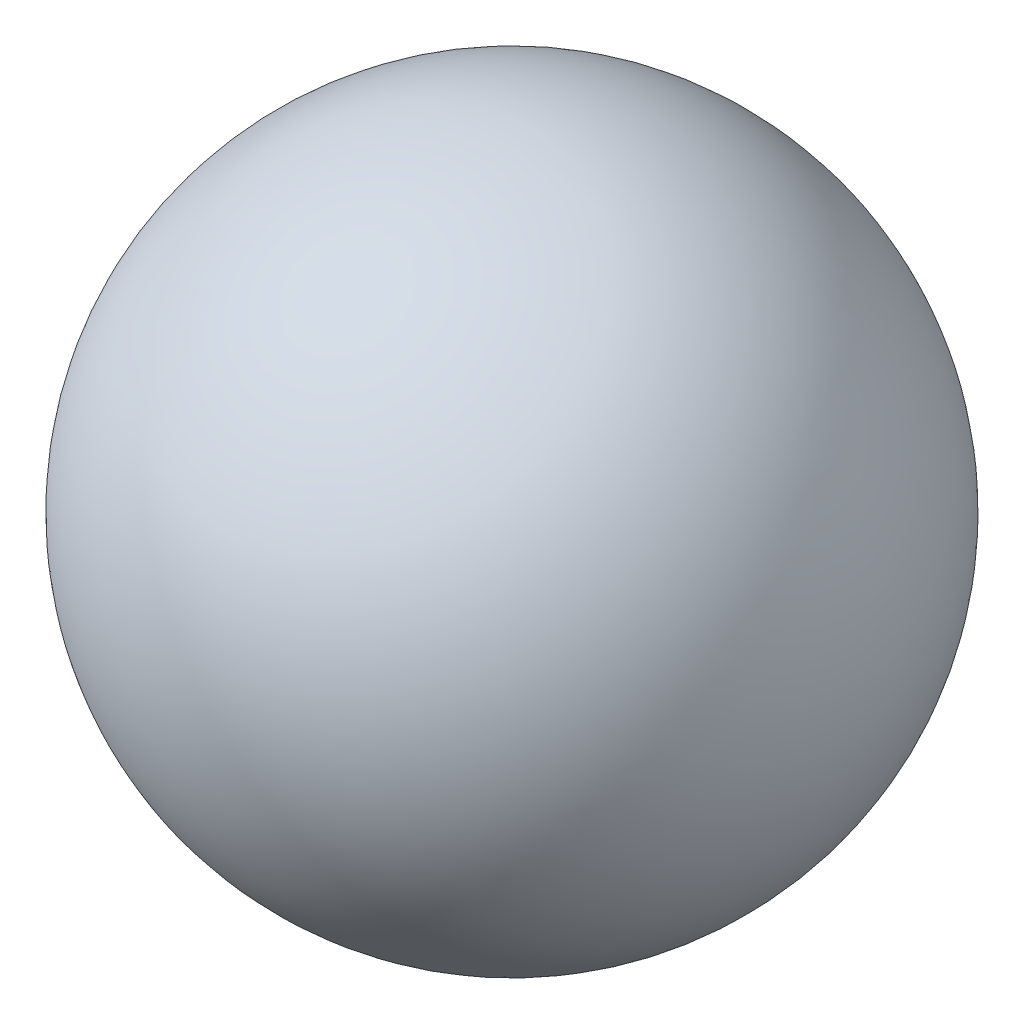
ISO-10303-21;
HEADER;
FILE_DESCRIPTION(('STEP AP214'),'2;1');
FILE_NAME('part.step','',(''),(''),'','','');
FILE_SCHEMA(('AUTOMOTIVE_DESIGN { 1 0 10303 214 1 1 1 1 }'));
ENDSEC;
DATA;
#1=APPLICATION_CONTEXT('core data for automotive mechanical design processes');
#2=APPLICATION_PROTOCOL_DEFINITION('international standard','automotive_design',2000,#1);
#3=PRODUCT_CONTEXT('',#1,'mechanical');
#4=PRODUCT('Part','Part','',(#3));
#5=PRODUCT_RELATED_PRODUCT_CATEGORY('part','',(#4));
#6=PRODUCT_DEFINITION_FORMATION('','',#4);
#7=PRODUCT_DEFINITION_CONTEXT('part definition',#1,'design');
#8=PRODUCT_DEFINITION('design','',#6,#7);
#9=PRODUCT_DEFINITION_SHAPE('','',#8);
#10=(LENGTH_UNIT() NAMED_UNIT(*) SI_UNIT(.MILLI.,.METRE.));
#11=(NAMED_UNIT(*) PLANE_ANGLE_UNIT() SI_UNIT($,.RADIAN.));
#12=(NAMED_UNIT(*) SI_UNIT($,.STERADIAN.) SOLID_ANGLE_UNIT());
#13=UNCERTAINTY_MEASURE_WITH_UNIT(LENGTH_MEASURE(1.E-05),#10,'distance_accuracy_value','');
#14=(GEOMETRIC_REPRESENTATION_CONTEXT(3) GLOBAL_UNCERTAINTY_ASSIGNED_CONTEXT((#13)) GLOBAL_UNIT_ASSIGNED_CONTEXT((#10,
#11,#12)) REPRESENTATION_CONTEXT('',''));
#15=CARTESIAN_POINT('',(0.,0.,0.));
#16=DIRECTION('',(0.,0.,1.));
#17=DIRECTION('',(1.,0.,0.));
#18=AXIS2_PLACEMENT_3D('',#15,#16,#17);
#19=CARTESIAN_POINT('',(0.,0.,0.));
#20=DIRECTION('',(0.,0.,1.));
#21=DIRECTION('',(0.,1.,0.));
#22=AXIS2_PLACEMENT_3D('',#19,#20,#21);
#23=SPHERICAL_SURFACE('',#22,4.);
#24=CARTESIAN_POINT('',(0.,0.,4.));
#25=VERTEX_POINT('',#24);
#26=VERTEX_LOOP('',#25);
#27=FACE_BOUND('',#26,.T.);
#28=ADVANCED_FACE('F35',(#27),#23,.T.);
#29=CLOSED_SHELL('',(#28));
#30=MANIFOLD_SOLID_BREP('B2',#29);
#31=ADVANCED_BREP_SHAPE_REPRESENTATION('',(#18,#30),#14);
#32=SHAPE_DEFINITION_REPRESENTATION(#9,#31);
ENDSEC;
END-ISO-10303-21;
